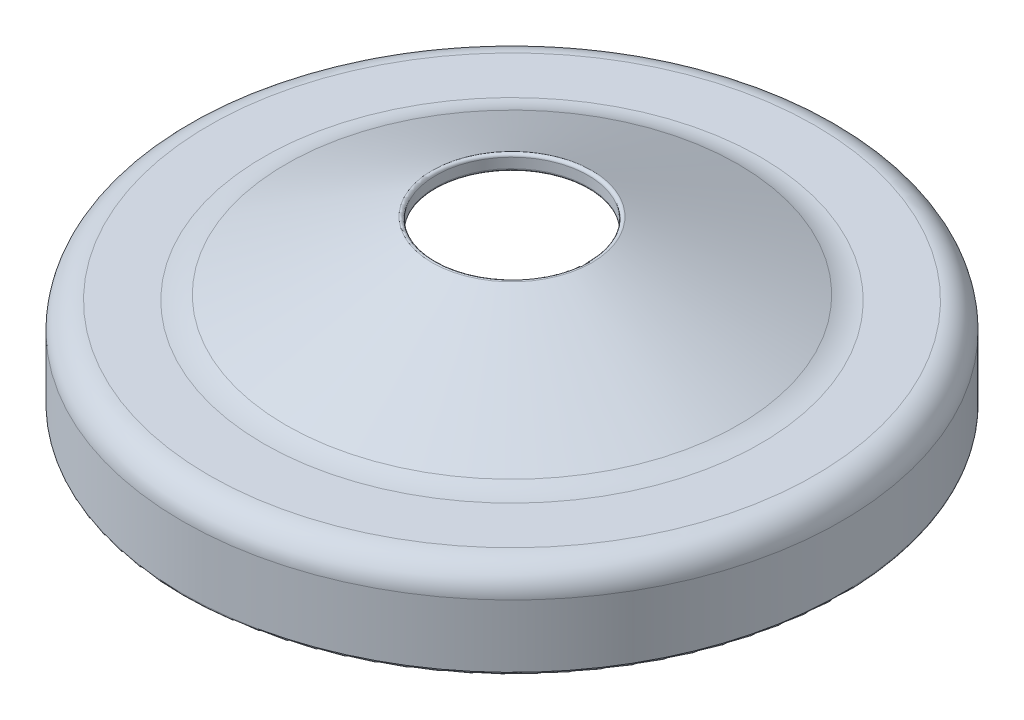
ISO-10303-21;
HEADER;
FILE_DESCRIPTION(('STEP AP214'),'2;1');
FILE_NAME('part.step','',(''),(''),'','','');
FILE_SCHEMA(('AUTOMOTIVE_DESIGN { 1 0 10303 214 1 1 1 1 }'));
ENDSEC;
DATA;
#1=APPLICATION_CONTEXT('core data for automotive mechanical design processes');
#2=APPLICATION_PROTOCOL_DEFINITION('international standard','automotive_design',2000,#1);
#3=PRODUCT_CONTEXT('',#1,'mechanical');
#4=PRODUCT('Part','Part','',(#3));
#5=PRODUCT_RELATED_PRODUCT_CATEGORY('part','',(#4));
#6=PRODUCT_DEFINITION_FORMATION('','',#4);
#7=PRODUCT_DEFINITION_CONTEXT('part definition',#1,'design');
#8=PRODUCT_DEFINITION('design','',#6,#7);
#9=PRODUCT_DEFINITION_SHAPE('','',#8);
#10=(LENGTH_UNIT() NAMED_UNIT(*) SI_UNIT(.MILLI.,.METRE.));
#11=(NAMED_UNIT(*) PLANE_ANGLE_UNIT() SI_UNIT($,.RADIAN.));
#12=(NAMED_UNIT(*) SI_UNIT($,.STERADIAN.) SOLID_ANGLE_UNIT());
#13=UNCERTAINTY_MEASURE_WITH_UNIT(LENGTH_MEASURE(1.E-05),#10,'distance_accuracy_value','');
#14=(GEOMETRIC_REPRESENTATION_CONTEXT(3) GLOBAL_UNCERTAINTY_ASSIGNED_CONTEXT((#13)) GLOBAL_UNIT_ASSIGNED_CONTEXT((#10,
#11,#12)) REPRESENTATION_CONTEXT('',''));
#15=CARTESIAN_POINT('',(0.,0.,0.));
#16=DIRECTION('',(0.,0.,1.));
#17=DIRECTION('',(1.,0.,0.));
#18=AXIS2_PLACEMENT_3D('',#15,#16,#17);
#19=CARTESIAN_POINT('',(0.,0.,0.));
#20=DIRECTION('',(0.,-1.,0.));
#21=DIRECTION('',(0.,0.,-1.));
#22=AXIS2_PLACEMENT_3D('',#19,#20,#21);
#23=CYLINDRICAL_SURFACE('',#22,14.35);
#24=CARTESIAN_POINT('',(0.,-2.65559435203704,0.));
#25=DIRECTION('',(0.,1.,0.));
#26=DIRECTION('',(0.,0.,1.));
#27=AXIS2_PLACEMENT_3D('',#24,#25,#26);
#28=CIRCLE('',#27,14.35);
#29=CARTESIAN_POINT('',(0.,-2.65559435203704,14.35));
#30=VERTEX_POINT('',#29);
#31=EDGE_CURVE('E46',#30,#30,#28,.F.);
#32=ORIENTED_EDGE('',*,*,#31,.T.);
#33=EDGE_LOOP('',(#32));
#34=FACE_BOUND('',#33,.T.);
#35=CARTESIAN_POINT('',(0.,-0.782357093532086,0.));
#36=DIRECTION('',(0.,1.,0.));
#37=DIRECTION('',(0.,0.,1.));
#38=AXIS2_PLACEMENT_3D('',#35,#36,#37);
#39=CIRCLE('',#38,14.35);
#40=CARTESIAN_POINT('',(0.,-0.782357093532086,14.35));
#41=VERTEX_POINT('',#40);
#42=EDGE_CURVE('E50',#41,#41,#39,.T.);
#43=ORIENTED_EDGE('',*,*,#42,.T.);
#44=EDGE_LOOP('',(#43));
#45=FACE_BOUND('',#44,.T.);
#46=ADVANCED_FACE('F35',(#34,#45),#23,.F.);
#47=CARTESIAN_POINT('',(0.,-16.7,0.));
#48=DIRECTION('',(0.,-1.,0.));
#49=DIRECTION('',(0.,0.,-1.));
#50=AXIS2_PLACEMENT_3D('',#47,#48,#49);
#51=CONICAL_SURFACE('',#50,44.0054977693953,1.13734088267105);
#52=CARTESIAN_POINT('',(0.,-3.10935427814399,0.));
#53=DIRECTION('',(0.,1.,0.));
#54=DIRECTION('',(0.,0.,1.));
#55=AXIS2_PLACEMENT_3D('',#52,#53,#54);
#56=CIRCLE('',#55,14.6399954060993);
#57=CARTESIAN_POINT('',(0.,-3.10935427814399,14.6399954060993));
#58=VERTEX_POINT('',#57);
#59=EDGE_CURVE('E42',#58,#58,#56,.T.);
#60=ORIENTED_EDGE('',*,*,#59,.T.);
#61=EDGE_LOOP('',(#60));
#62=FACE_BOUND('',#61,.T.);
#63=CARTESIAN_POINT('',(0.,-15.5255021231166,0.));
#64=DIRECTION('',(0.,1.,0.));
#65=DIRECTION('',(0.,0.,1.));
#66=AXIS2_PLACEMENT_3D('',#63,#64,#65);
#67=CIRCLE('',#66,41.4677434282722);
#68=CARTESIAN_POINT('',(0.,-15.5255021231166,41.4677434282722));
#69=VERTEX_POINT('',#68);
#70=EDGE_CURVE('E70',#69,#69,#67,.F.);
#71=ORIENTED_EDGE('',*,*,#70,.T.);
#72=EDGE_LOOP('',(#71));
#73=FACE_BOUND('',#72,.T.);
#74=ADVANCED_FACE('F112',(#62,#73),#51,.F.);
#75=CARTESIAN_POINT('',(-44.0054977693953,-16.7,0.));
#76=DIRECTION('',(0.,1.,0.));
#77=DIRECTION('',(0.,0.,1.));
#78=AXIS2_PLACEMENT_3D('',#75,#76,#77);
#79=PLANE('',#78);
#80=CARTESIAN_POINT('',(0.,-16.7,0.));
#81=DIRECTION('',(0.,1.,0.));
#82=DIRECTION('',(0.,0.,1.));
#83=AXIS2_PLACEMENT_3D('',#80,#81,#82);
#84=CIRCLE('',#83,46.8018601133509);
#85=CARTESIAN_POINT('',(0.,-16.7,46.8018601133509));
#86=VERTEX_POINT('',#85);
#87=EDGE_CURVE('E67',#86,#86,#84,.T.);
#88=ORIENTED_EDGE('',*,*,#87,.T.);
#89=EDGE_LOOP('',(#88));
#90=FACE_BOUND('',#89,.T.);
#91=CARTESIAN_POINT('',(0.,-16.7,0.));
#92=DIRECTION('',(0.,1.,0.));
#93=DIRECTION('',(0.,0.,1.));
#94=AXIS2_PLACEMENT_3D('',#91,#92,#93);
#95=CIRCLE('',#94,57.1);
#96=CARTESIAN_POINT('',(0.,-16.7,57.1));
#97=VERTEX_POINT('',#96);
#98=EDGE_CURVE('E82',#97,#97,#95,.F.);
#99=ORIENTED_EDGE('',*,*,#98,.T.);
#100=EDGE_LOOP('',(#99));
#101=FACE_BOUND('',#100,.T.);
#102=ADVANCED_FACE('F118',(#90,#101),#79,.F.);
#103=CARTESIAN_POINT('',(0.,0.,0.));
#104=DIRECTION('',(0.,-1.,0.));
#105=DIRECTION('',(0.,0.,-1.));
#106=AXIS2_PLACEMENT_3D('',#103,#104,#105);
#107=CYLINDRICAL_SURFACE('',#106,59.4);
#108=CARTESIAN_POINT('',(0.,-30.8,0.));
#109=DIRECTION('',(0.,1.,0.));
#110=DIRECTION('',(0.,0.,1.));
#111=AXIS2_PLACEMENT_3D('',#108,#109,#110);
#112=CIRCLE('',#111,59.4);
#113=CARTESIAN_POINT('',(0.,-30.8,59.4));
#114=VERTEX_POINT('',#113);
#115=EDGE_CURVE('E55',#114,#114,#112,.F.);
#116=ORIENTED_EDGE('',*,*,#115,.T.);
#117=EDGE_LOOP('',(#116));
#118=FACE_BOUND('',#117,.T.);
#119=CARTESIAN_POINT('',(0.,-19.,0.));
#120=DIRECTION('',(0.,1.,0.));
#121=DIRECTION('',(0.,0.,1.));
#122=AXIS2_PLACEMENT_3D('',#119,#120,#121);
#123=CIRCLE('',#122,59.4);
#124=CARTESIAN_POINT('',(0.,-19.,59.4));
#125=VERTEX_POINT('',#124);
#126=EDGE_CURVE('E79',#125,#125,#123,.T.);
#127=ORIENTED_EDGE('',*,*,#126,.T.);
#128=EDGE_LOOP('',(#127));
#129=FACE_BOUND('',#128,.T.);
#130=ADVANCED_FACE('F124',(#118,#129),#107,.F.);
#131=CARTESIAN_POINT('',(-62.1,-31.3,0.));
#132=DIRECTION('',(0.,1.,0.));
#133=DIRECTION('',(0.,0.,1.));
#134=AXIS2_PLACEMENT_3D('',#131,#132,#133);
#135=PLANE('',#134);
#136=CARTESIAN_POINT('',(0.,-31.3,0.));
#137=DIRECTION('',(0.,1.,0.));
#138=DIRECTION('',(0.,0.,1.));
#139=AXIS2_PLACEMENT_3D('',#136,#137,#138);
#140=CIRCLE('',#139,61.6);
#141=CARTESIAN_POINT('',(0.,-31.3,61.6));
#142=VERTEX_POINT('',#141);
#143=EDGE_CURVE('E61',#142,#142,#140,.F.);
#144=ORIENTED_EDGE('',*,*,#143,.T.);
#145=EDGE_LOOP('',(#144));
#146=FACE_BOUND('',#145,.T.);
#147=CARTESIAN_POINT('',(0.,-31.3,0.));
#148=DIRECTION('',(0.,1.,0.));
#149=DIRECTION('',(0.,0.,1.));
#150=AXIS2_PLACEMENT_3D('',#147,#148,#149);
#151=CIRCLE('',#150,59.9);
#152=CARTESIAN_POINT('',(0.,-31.3,59.9));
#153=VERTEX_POINT('',#152);
#154=EDGE_CURVE('E64',#153,#153,#151,.T.);
#155=ORIENTED_EDGE('',*,*,#154,.T.);
#156=EDGE_LOOP('',(#155));
#157=FACE_BOUND('',#156,.T.);
#158=ADVANCED_FACE('F128',(#146,#157),#135,.F.);
#159=CARTESIAN_POINT('',(0.,0.,0.));
#160=DIRECTION('',(0.,-1.,0.));
#161=DIRECTION('',(0.,0.,-1.));
#162=AXIS2_PLACEMENT_3D('',#159,#160,#161);
#163=CYLINDRICAL_SURFACE('',#162,62.1);
#164=CARTESIAN_POINT('',(0.,-30.8,0.));
#165=DIRECTION('',(0.,1.,0.));
#166=DIRECTION('',(0.,0.,1.));
#167=AXIS2_PLACEMENT_3D('',#164,#165,#166);
#168=CIRCLE('',#167,62.1);
#169=CARTESIAN_POINT('',(0.,-30.8,62.1));
#170=VERTEX_POINT('',#169);
#171=EDGE_CURVE('E58',#170,#170,#168,.T.);
#172=ORIENTED_EDGE('',*,*,#171,.T.);
#173=EDGE_LOOP('',(#172));
#174=FACE_BOUND('',#173,.T.);
#175=CARTESIAN_POINT('',(0.,-19.,0.));
#176=DIRECTION('',(0.,-1.,0.));
#177=DIRECTION('',(0.,0.,-1.));
#178=AXIS2_PLACEMENT_3D('',#175,#176,#177);
#179=CIRCLE('',#178,62.1);
#180=CARTESIAN_POINT('',(0.,-19.,-62.1));
#181=VERTEX_POINT('',#180);
#182=EDGE_CURVE('E88',#181,#181,#179,.T.);
#183=ORIENTED_EDGE('',*,*,#182,.T.);
#184=EDGE_LOOP('',(#183));
#185=FACE_BOUND('',#184,.T.);
#186=ADVANCED_FACE('F92',(#174,#185),#163,.T.);
#187=CARTESIAN_POINT('',(-44.6,-14.,0.));
#188=DIRECTION('',(0.,-1.,0.));
#189=DIRECTION('',(0.,0.,-1.));
#190=AXIS2_PLACEMENT_3D('',#187,#188,#189);
#191=PLANE('',#190);
#192=CARTESIAN_POINT('',(0.,-14.,0.));
#193=DIRECTION('',(0.,-1.,0.));
#194=DIRECTION('',(0.,0.,-1.));
#195=AXIS2_PLACEMENT_3D('',#192,#193,#194);
#196=CIRCLE('',#195,46.8018601133509);
#197=CARTESIAN_POINT('',(0.,-14.,-46.8018601133509));
#198=VERTEX_POINT('',#197);
#199=EDGE_CURVE('E76',#198,#198,#196,.T.);
#200=ORIENTED_EDGE('',*,*,#199,.T.);
#201=EDGE_LOOP('',(#200));
#202=FACE_BOUND('',#201,.T.);
#203=CARTESIAN_POINT('',(0.,-14.,0.));
#204=DIRECTION('',(0.,-1.,0.));
#205=DIRECTION('',(0.,0.,-1.));
#206=AXIS2_PLACEMENT_3D('',#203,#204,#205);
#207=CIRCLE('',#206,57.1);
#208=CARTESIAN_POINT('',(0.,-14.,-57.1));
#209=VERTEX_POINT('',#208);
#210=EDGE_CURVE('E85',#209,#209,#207,.F.);
#211=ORIENTED_EDGE('',*,*,#210,.T.);
#212=EDGE_LOOP('',(#211));
#213=FACE_BOUND('',#212,.T.);
#214=ADVANCED_FACE('F107',(#202,#213),#191,.F.);
#215=CARTESIAN_POINT('',(0.,0.,0.));
#216=DIRECTION('',(0.,-1.,0.));
#217=DIRECTION('',(0.,0.,-1.));
#218=AXIS2_PLACEMENT_3D('',#215,#216,#217);
#219=CONICAL_SURFACE('',#218,14.35,1.13734088267105);
#220=CARTESIAN_POINT('',(0.,-0.328597167425134,0.));
#221=DIRECTION('',(0.,1.,0.));
#222=DIRECTION('',(0.,0.,1.));
#223=AXIS2_PLACEMENT_3D('',#220,#221,#222);
#224=CIRCLE('',#223,15.0600045939007);
#225=CARTESIAN_POINT('',(0.,-0.328597167425134,15.0600045939007));
#226=VERTEX_POINT('',#225);
#227=EDGE_CURVE('E10',#226,#226,#224,.F.);
#228=ORIENTED_EDGE('',*,*,#227,.T.);
#229=EDGE_LOOP('',(#228));
#230=FACE_BOUND('',#229,.T.);
#231=CARTESIAN_POINT('',(0.,-13.075198522139,0.));
#232=DIRECTION('',(0.,-1.,0.));
#233=DIRECTION('',(0.,0.,-1.));
#234=AXIS2_PLACEMENT_3D('',#231,#232,#233);
#235=CIRCLE('',#234,42.6017682353361);
#236=CARTESIAN_POINT('',(0.,-13.075198522139,-42.6017682353361));
#237=VERTEX_POINT('',#236);
#238=EDGE_CURVE('E73',#237,#237,#235,.F.);
#239=ORIENTED_EDGE('',*,*,#238,.T.);
#240=EDGE_LOOP('',(#239));
#241=FACE_BOUND('',#240,.T.);
#242=ADVANCED_FACE('F97',(#230,#241),#219,.T.);
#243=CARTESIAN_POINT('',(0.,-19.,0.));
#244=DIRECTION('',(0.,-1.,0.));
#245=DIRECTION('',(0.,0.,-1.));
#246=AXIS2_PLACEMENT_3D('',#243,#244,#245);
#247=TOROIDAL_SURFACE('',#246,57.1,5.);
#248=ORIENTED_EDGE('',*,*,#210,.F.);
#249=EDGE_LOOP('',(#248));
#250=FACE_BOUND('',#249,.T.);
#251=ORIENTED_EDGE('',*,*,#182,.F.);
#252=EDGE_LOOP('',(#251));
#253=FACE_BOUND('',#252,.T.);
#254=ADVANCED_FACE('F94',(#250,#253),#247,.T.);
#255=CARTESIAN_POINT('',(0.,-19.,0.));
#256=DIRECTION('',(0.,1.,0.));
#257=DIRECTION('',(0.,0.,1.));
#258=AXIS2_PLACEMENT_3D('',#255,#256,#257);
#259=TOROIDAL_SURFACE('',#258,57.1,2.3);
#260=ORIENTED_EDGE('',*,*,#126,.F.);
#261=EDGE_LOOP('',(#260));
#262=FACE_BOUND('',#261,.T.);
#263=ORIENTED_EDGE('',*,*,#98,.F.);
#264=EDGE_LOOP('',(#263));
#265=FACE_BOUND('',#264,.T.);
#266=ADVANCED_FACE('F96',(#262,#265),#259,.F.);
#267=CARTESIAN_POINT('',(0.,-4.,0.));
#268=DIRECTION('',(0.,-1.,0.));
#269=DIRECTION('',(0.,0.,-1.));
#270=AXIS2_PLACEMENT_3D('',#267,#268,#269);
#271=TOROIDAL_SURFACE('',#270,46.8018601133509,10.);
#272=ORIENTED_EDGE('',*,*,#238,.F.);
#273=EDGE_LOOP('',(#272));
#274=FACE_BOUND('',#273,.T.);
#275=ORIENTED_EDGE('',*,*,#199,.F.);
#276=EDGE_LOOP('',(#275));
#277=FACE_BOUND('',#276,.T.);
#278=ADVANCED_FACE('F103',(#274,#277),#271,.F.);
#279=CARTESIAN_POINT('',(0.,-4.,0.));
#280=DIRECTION('',(0.,1.,0.));
#281=DIRECTION('',(0.,0.,1.));
#282=AXIS2_PLACEMENT_3D('',#279,#280,#281);
#283=TOROIDAL_SURFACE('',#282,46.8018601133509,12.7);
#284=ORIENTED_EDGE('',*,*,#87,.F.);
#285=EDGE_LOOP('',(#284));
#286=FACE_BOUND('',#285,.T.);
#287=ORIENTED_EDGE('',*,*,#70,.F.);
#288=EDGE_LOOP('',(#287));
#289=FACE_BOUND('',#288,.T.);
#290=ADVANCED_FACE('F144',(#286,#289),#283,.T.);
#291=CARTESIAN_POINT('',(0.,-30.8,0.));
#292=DIRECTION('',(0.,1.,0.));
#293=DIRECTION('',(0.,0.,1.));
#294=AXIS2_PLACEMENT_3D('',#291,#292,#293);
#295=TOROIDAL_SURFACE('',#294,61.6,0.5);
#296=ORIENTED_EDGE('',*,*,#171,.F.);
#297=EDGE_LOOP('',(#296));
#298=FACE_BOUND('',#297,.T.);
#299=ORIENTED_EDGE('',*,*,#143,.F.);
#300=EDGE_LOOP('',(#299));
#301=FACE_BOUND('',#300,.T.);
#302=ADVANCED_FACE('F149',(#298,#301),#295,.T.);
#303=CARTESIAN_POINT('',(0.,-30.8,0.));
#304=DIRECTION('',(0.,1.,0.));
#305=DIRECTION('',(0.,0.,1.));
#306=AXIS2_PLACEMENT_3D('',#303,#304,#305);
#307=TOROIDAL_SURFACE('',#306,59.9,0.5);
#308=ORIENTED_EDGE('',*,*,#154,.F.);
#309=EDGE_LOOP('',(#308));
#310=FACE_BOUND('',#309,.T.);
#311=ORIENTED_EDGE('',*,*,#115,.F.);
#312=EDGE_LOOP('',(#311));
#313=FACE_BOUND('',#312,.T.);
#314=ADVANCED_FACE('F156',(#310,#313),#307,.T.);
#315=CARTESIAN_POINT('',(0.,-2.65559435203704,0.));
#316=DIRECTION('',(0.,1.,0.));
#317=DIRECTION('',(0.,0.,1.));
#318=AXIS2_PLACEMENT_3D('',#315,#316,#317);
#319=TOROIDAL_SURFACE('',#318,14.85,0.5);
#320=ORIENTED_EDGE('',*,*,#59,.F.);
#321=EDGE_LOOP('',(#320));
#322=FACE_BOUND('',#321,.T.);
#323=ORIENTED_EDGE('',*,*,#31,.F.);
#324=EDGE_LOOP('',(#323));
#325=FACE_BOUND('',#324,.T.);
#326=ADVANCED_FACE('F159',(#322,#325),#319,.T.);
#327=CARTESIAN_POINT('',(0.,-0.782357093532086,0.));
#328=DIRECTION('',(0.,1.,0.));
#329=DIRECTION('',(0.,0.,1.));
#330=AXIS2_PLACEMENT_3D('',#327,#328,#329);
#331=TOROIDAL_SURFACE('',#330,14.85,0.5);
#332=ORIENTED_EDGE('',*,*,#42,.F.);
#333=EDGE_LOOP('',(#332));
#334=FACE_BOUND('',#333,.T.);
#335=ORIENTED_EDGE('',*,*,#227,.F.);
#336=EDGE_LOOP('',(#335));
#337=FACE_BOUND('',#336,.T.);
#338=ADVANCED_FACE('F37',(#334,#337),#331,.T.);
#339=CLOSED_SHELL('',(#46,#74,#102,#130,#158,#186,#214,#242,#254,#266,#278,#290,#302,#314,#326,#338));
#340=MANIFOLD_SOLID_BREP('B2',#339);
#341=ADVANCED_BREP_SHAPE_REPRESENTATION('',(#18,#340),#14);
#342=SHAPE_DEFINITION_REPRESENTATION(#9,#341);
ENDSEC;
END-ISO-10303-21;
